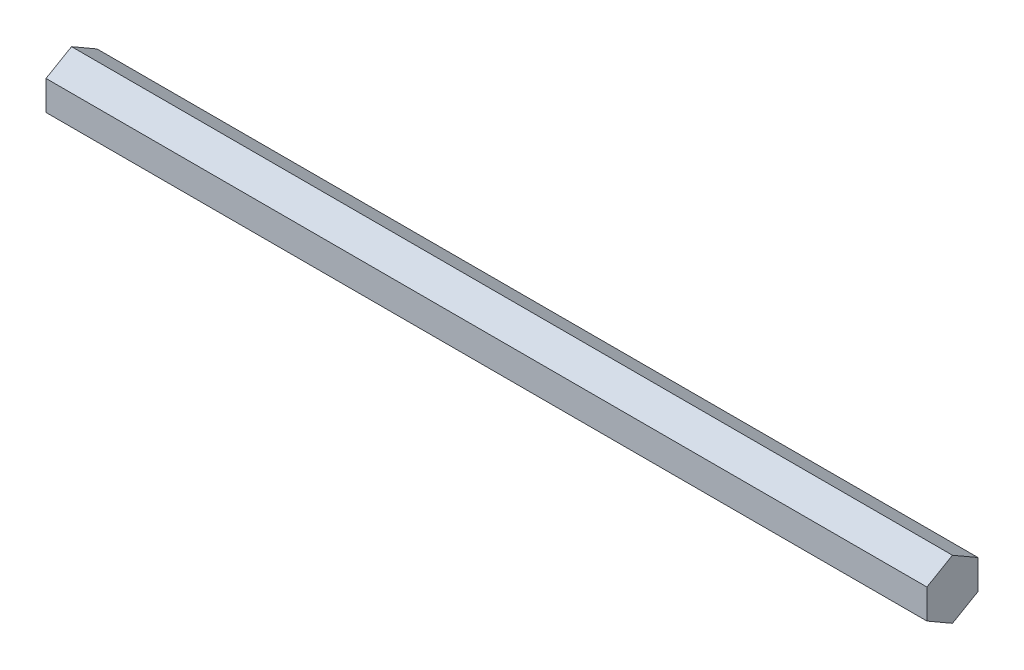
ISO-10303-21;
HEADER;
FILE_DESCRIPTION(('STEP AP214'),'2;1');
FILE_NAME('part.step','',(''),(''),'','','');
FILE_SCHEMA(('AUTOMOTIVE_DESIGN { 1 0 10303 214 1 1 1 1 }'));
ENDSEC;
DATA;
#1=APPLICATION_CONTEXT('core data for automotive mechanical design processes');
#2=APPLICATION_PROTOCOL_DEFINITION('international standard','automotive_design',2000,#1);
#3=PRODUCT_CONTEXT('',#1,'mechanical');
#4=PRODUCT('Part','Part','',(#3));
#5=PRODUCT_RELATED_PRODUCT_CATEGORY('part','',(#4));
#6=PRODUCT_DEFINITION_FORMATION('','',#4);
#7=PRODUCT_DEFINITION_CONTEXT('part definition',#1,'design');
#8=PRODUCT_DEFINITION('design','',#6,#7);
#9=PRODUCT_DEFINITION_SHAPE('','',#8);
#10=(LENGTH_UNIT() NAMED_UNIT(*) SI_UNIT(.MILLI.,.METRE.));
#11=(NAMED_UNIT(*) PLANE_ANGLE_UNIT() SI_UNIT($,.RADIAN.));
#12=(NAMED_UNIT(*) SI_UNIT($,.STERADIAN.) SOLID_ANGLE_UNIT());
#13=UNCERTAINTY_MEASURE_WITH_UNIT(LENGTH_MEASURE(1.E-05),#10,'distance_accuracy_value','');
#14=(GEOMETRIC_REPRESENTATION_CONTEXT(3) GLOBAL_UNCERTAINTY_ASSIGNED_CONTEXT((#13)) GLOBAL_UNIT_ASSIGNED_CONTEXT((#10,
#11,#12)) REPRESENTATION_CONTEXT('',''));
#15=CARTESIAN_POINT('',(0.,0.,0.));
#16=DIRECTION('',(0.,0.,1.));
#17=DIRECTION('',(1.,0.,0.));
#18=AXIS2_PLACEMENT_3D('',#15,#16,#17);
#19=CARTESIAN_POINT('',(142.24,-4.7625,0.));
#20=DIRECTION('',(0.,0.866025403784439,0.5));
#21=DIRECTION('',(0.,-0.5,0.866025403784439));
#22=AXIS2_PLACEMENT_3D('',#19,#20,#21);
#23=PLANE('',#22);
#24=DIRECTION('',(0.,0.499999999999999,-0.866025403784439));
#25=VECTOR('',#24,1.);
#26=CARTESIAN_POINT('',(0.,-4.7625,0.));
#27=LINE('',#26,#25);
#28=CARTESIAN_POINT('',(0.,-4.7625,0.));
#29=VERTEX_POINT('',#28);
#30=CARTESIAN_POINT('',(0.,-2.38125,-4.12444598552339));
#31=VERTEX_POINT('',#30);
#32=EDGE_CURVE('E137',#29,#31,#27,.T.);
#33=ORIENTED_EDGE('',*,*,#32,.T.);
#34=DIRECTION('',(-1.,0.,0.));
#35=VECTOR('',#34,1.);
#36=CARTESIAN_POINT('',(142.24,-2.38125,-4.12444598552339));
#37=LINE('',#36,#35);
#38=CARTESIAN_POINT('',(142.24,-2.38125,-4.12444598552339));
#39=VERTEX_POINT('',#38);
#40=EDGE_CURVE('E11',#39,#31,#37,.T.);
#41=ORIENTED_EDGE('',*,*,#40,.F.);
#42=DIRECTION('',(0.,0.499999999999999,-0.866025403784439));
#43=VECTOR('',#42,1.);
#44=CARTESIAN_POINT('',(142.24,-4.7625,0.));
#45=LINE('',#44,#43);
#46=CARTESIAN_POINT('',(142.24,-4.7625,0.));
#47=VERTEX_POINT('',#46);
#48=EDGE_CURVE('E149',#47,#39,#45,.T.);
#49=ORIENTED_EDGE('',*,*,#48,.F.);
#50=DIRECTION('',(-1.,0.,0.));
#51=VECTOR('',#50,1.);
#52=CARTESIAN_POINT('',(142.24,-4.7625,0.));
#53=LINE('',#52,#51);
#54=EDGE_CURVE('E133',#47,#29,#53,.T.);
#55=ORIENTED_EDGE('',*,*,#54,.T.);
#56=EDGE_LOOP('',(#33,#41,#49,#55));
#57=FACE_BOUND('',#56,.T.);
#58=ADVANCED_FACE('F41',(#57),#23,.F.);
#59=CARTESIAN_POINT('',(142.24,-2.38125,-4.12444598552339));
#60=DIRECTION('',(0.,0.,1.));
#61=DIRECTION('',(1.,0.,0.));
#62=AXIS2_PLACEMENT_3D('',#59,#60,#61);
#63=PLANE('',#62);
#64=DIRECTION('',(0.,1.,0.));
#65=VECTOR('',#64,1.);
#66=CARTESIAN_POINT('',(0.,-2.38125,-4.12444598552339));
#67=LINE('',#66,#65);
#68=CARTESIAN_POINT('',(0.,2.38125,-4.12444598552339));
#69=VERTEX_POINT('',#68);
#70=EDGE_CURVE('E140',#31,#69,#67,.T.);
#71=ORIENTED_EDGE('',*,*,#70,.T.);
#72=DIRECTION('',(-1.,0.,0.));
#73=VECTOR('',#72,1.);
#74=CARTESIAN_POINT('',(142.24,2.38125,-4.12444598552339));
#75=LINE('',#74,#73);
#76=CARTESIAN_POINT('',(142.24,2.38125,-4.12444598552339));
#77=VERTEX_POINT('',#76);
#78=EDGE_CURVE('E48',#77,#69,#75,.T.);
#79=ORIENTED_EDGE('',*,*,#78,.F.);
#80=DIRECTION('',(0.,1.,0.));
#81=VECTOR('',#80,1.);
#82=CARTESIAN_POINT('',(142.24,-2.38125,-4.12444598552339));
#83=LINE('',#82,#81);
#84=EDGE_CURVE('E99',#39,#77,#83,.T.);
#85=ORIENTED_EDGE('',*,*,#84,.F.);
#86=ORIENTED_EDGE('',*,*,#40,.T.);
#87=EDGE_LOOP('',(#71,#79,#85,#86));
#88=FACE_BOUND('',#87,.T.);
#89=ADVANCED_FACE('F200',(#88),#63,.F.);
#90=CARTESIAN_POINT('',(142.24,2.38125,-4.12444598552339));
#91=DIRECTION('',(0.,-0.866025403784439,0.5));
#92=DIRECTION('',(0.,-0.5,-0.866025403784439));
#93=AXIS2_PLACEMENT_3D('',#90,#91,#92);
#94=PLANE('',#93);
#95=DIRECTION('',(0.,0.5,0.866025403784439));
#96=VECTOR('',#95,1.);
#97=CARTESIAN_POINT('',(0.,2.38125,-4.12444598552339));
#98=LINE('',#97,#96);
#99=CARTESIAN_POINT('',(0.,4.7625,0.));
#100=VERTEX_POINT('',#99);
#101=EDGE_CURVE('E143',#69,#100,#98,.T.);
#102=ORIENTED_EDGE('',*,*,#101,.T.);
#103=DIRECTION('',(-1.,0.,0.));
#104=VECTOR('',#103,1.);
#105=CARTESIAN_POINT('',(142.24,4.7625,0.));
#106=LINE('',#105,#104);
#107=CARTESIAN_POINT('',(142.24,4.7625,0.));
#108=VERTEX_POINT('',#107);
#109=EDGE_CURVE('E128',#108,#100,#106,.T.);
#110=ORIENTED_EDGE('',*,*,#109,.F.);
#111=DIRECTION('',(0.,0.5,0.866025403784439));
#112=VECTOR('',#111,1.);
#113=CARTESIAN_POINT('',(142.24,2.38125,-4.12444598552339));
#114=LINE('',#113,#112);
#115=EDGE_CURVE('E116',#77,#108,#114,.T.);
#116=ORIENTED_EDGE('',*,*,#115,.F.);
#117=ORIENTED_EDGE('',*,*,#78,.T.);
#118=EDGE_LOOP('',(#102,#110,#116,#117));
#119=FACE_BOUND('',#118,.T.);
#120=ADVANCED_FACE('F155',(#119),#94,.F.);
#121=CARTESIAN_POINT('',(142.24,4.7625,0.));
#122=DIRECTION('',(0.,-0.866025403784439,-0.5));
#123=DIRECTION('',(0.,0.5,-0.866025403784439));
#124=AXIS2_PLACEMENT_3D('',#121,#122,#123);
#125=PLANE('',#124);
#126=DIRECTION('',(0.,-0.5,0.866025403784439));
#127=VECTOR('',#126,1.);
#128=CARTESIAN_POINT('',(0.,4.7625,0.));
#129=LINE('',#128,#127);
#130=CARTESIAN_POINT('',(0.,2.38125,4.12444598552339));
#131=VERTEX_POINT('',#130);
#132=EDGE_CURVE('E125',#100,#131,#129,.T.);
#133=ORIENTED_EDGE('',*,*,#132,.T.);
#134=DIRECTION('',(-1.,0.,0.));
#135=VECTOR('',#134,1.);
#136=CARTESIAN_POINT('',(142.24,2.38125,4.12444598552339));
#137=LINE('',#136,#135);
#138=CARTESIAN_POINT('',(142.24,2.38125,4.12444598552339));
#139=VERTEX_POINT('',#138);
#140=EDGE_CURVE('E122',#139,#131,#137,.T.);
#141=ORIENTED_EDGE('',*,*,#140,.F.);
#142=DIRECTION('',(0.,-0.5,0.866025403784439));
#143=VECTOR('',#142,1.);
#144=CARTESIAN_POINT('',(142.24,4.7625,0.));
#145=LINE('',#144,#143);
#146=EDGE_CURVE('E109',#108,#139,#145,.T.);
#147=ORIENTED_EDGE('',*,*,#146,.F.);
#148=ORIENTED_EDGE('',*,*,#109,.T.);
#149=EDGE_LOOP('',(#133,#141,#147,#148));
#150=FACE_BOUND('',#149,.T.);
#151=ADVANCED_FACE('F123',(#150),#125,.F.);
#152=CARTESIAN_POINT('',(142.24,2.38125,4.12444598552339));
#153=DIRECTION('',(0.,0.,-1.));
#154=DIRECTION('',(-1.,0.,0.));
#155=AXIS2_PLACEMENT_3D('',#152,#153,#154);
#156=PLANE('',#155);
#157=DIRECTION('',(0.,-1.,0.));
#158=VECTOR('',#157,1.);
#159=CARTESIAN_POINT('',(0.,2.38125,4.12444598552339));
#160=LINE('',#159,#158);
#161=CARTESIAN_POINT('',(0.,-2.38125,4.12444598552339));
#162=VERTEX_POINT('',#161);
#163=EDGE_CURVE('E146',#131,#162,#160,.T.);
#164=ORIENTED_EDGE('',*,*,#163,.T.);
#165=DIRECTION('',(-1.,0.,0.));
#166=VECTOR('',#165,1.);
#167=CARTESIAN_POINT('',(142.24,-2.38125,4.12444598552339));
#168=LINE('',#167,#166);
#169=CARTESIAN_POINT('',(142.24,-2.38125,4.12444598552339));
#170=VERTEX_POINT('',#169);
#171=EDGE_CURVE('E129',#170,#162,#168,.T.);
#172=ORIENTED_EDGE('',*,*,#171,.F.);
#173=DIRECTION('',(0.,-1.,0.));
#174=VECTOR('',#173,1.);
#175=CARTESIAN_POINT('',(142.24,2.38125,4.12444598552339));
#176=LINE('',#175,#174);
#177=EDGE_CURVE('E113',#139,#170,#176,.T.);
#178=ORIENTED_EDGE('',*,*,#177,.F.);
#179=ORIENTED_EDGE('',*,*,#140,.T.);
#180=EDGE_LOOP('',(#164,#172,#178,#179));
#181=FACE_BOUND('',#180,.T.);
#182=ADVANCED_FACE('F131',(#181),#156,.F.);
#183=CARTESIAN_POINT('',(142.24,-2.38125,4.12444598552339));
#184=DIRECTION('',(0.,0.866025403784439,-0.5));
#185=DIRECTION('',(0.,0.5,0.866025403784439));
#186=AXIS2_PLACEMENT_3D('',#183,#184,#185);
#187=PLANE('',#186);
#188=DIRECTION('',(0.,-0.5,-0.866025403784439));
#189=VECTOR('',#188,1.);
#190=CARTESIAN_POINT('',(0.,-2.38125,4.12444598552339));
#191=LINE('',#190,#189);
#192=EDGE_CURVE('E91',#162,#29,#191,.T.);
#193=ORIENTED_EDGE('',*,*,#192,.T.);
#194=ORIENTED_EDGE('',*,*,#54,.F.);
#195=DIRECTION('',(0.,-0.5,-0.866025403784439));
#196=VECTOR('',#195,1.);
#197=CARTESIAN_POINT('',(142.24,-2.38125,4.12444598552339));
#198=LINE('',#197,#196);
#199=EDGE_CURVE('E64',#170,#47,#198,.T.);
#200=ORIENTED_EDGE('',*,*,#199,.F.);
#201=ORIENTED_EDGE('',*,*,#171,.T.);
#202=EDGE_LOOP('',(#193,#194,#200,#201));
#203=FACE_BOUND('',#202,.T.);
#204=ADVANCED_FACE('F159',(#203),#187,.F.);
#205=CARTESIAN_POINT('',(142.24,0.,0.));
#206=DIRECTION('',(1.,0.,0.));
#207=DIRECTION('',(0.,0.,-1.));
#208=AXIS2_PLACEMENT_3D('',#205,#206,#207);
#209=PLANE('',#208);
#210=ORIENTED_EDGE('',*,*,#48,.T.);
#211=ORIENTED_EDGE('',*,*,#84,.T.);
#212=ORIENTED_EDGE('',*,*,#115,.T.);
#213=ORIENTED_EDGE('',*,*,#146,.T.);
#214=ORIENTED_EDGE('',*,*,#177,.T.);
#215=ORIENTED_EDGE('',*,*,#199,.T.);
#216=EDGE_LOOP('',(#210,#211,#212,#213,#214,#215));
#217=FACE_BOUND('',#216,.T.);
#218=ADVANCED_FACE('F111',(#217),#209,.T.);
#219=CARTESIAN_POINT('',(0.,0.,0.));
#220=DIRECTION('',(1.,0.,0.));
#221=DIRECTION('',(0.,0.,-1.));
#222=AXIS2_PLACEMENT_3D('',#219,#220,#221);
#223=PLANE('',#222);
#224=DIRECTION('',(0.,0.,-1.));
#225=VECTOR('',#224,1.);
#226=CARTESIAN_POINT('',(0.,2.4892,-1.66945835527575));
#227=LINE('',#226,#225);
#228=CARTESIAN_POINT('',(0.,2.4892,1.66945835527575));
#229=VERTEX_POINT('',#228);
#230=CARTESIAN_POINT('',(0.,2.4892,-1.66945835527575));
#231=VERTEX_POINT('',#230);
#232=EDGE_CURVE('E170',#229,#231,#227,.T.);
#233=ORIENTED_EDGE('',*,*,#232,.F.);
#234=CARTESIAN_POINT('',(0.,0.,0.));
#235=DIRECTION('',(-1.,0.,0.));
#236=DIRECTION('',(0.,0.,1.));
#237=AXIS2_PLACEMENT_3D('',#234,#235,#236);
#238=CIRCLE('',#237,2.9972);
#239=EDGE_CURVE('E55',#231,#229,#238,.T.);
#240=ORIENTED_EDGE('',*,*,#239,.F.);
#241=EDGE_LOOP('',(#233,#240));
#242=FACE_BOUND('',#241,.T.);
#243=ORIENTED_EDGE('',*,*,#32,.F.);
#244=ORIENTED_EDGE('',*,*,#192,.F.);
#245=ORIENTED_EDGE('',*,*,#163,.F.);
#246=ORIENTED_EDGE('',*,*,#132,.F.);
#247=ORIENTED_EDGE('',*,*,#101,.F.);
#248=ORIENTED_EDGE('',*,*,#70,.F.);
#249=EDGE_LOOP('',(#243,#244,#245,#246,#247,#248));
#250=FACE_BOUND('',#249,.T.);
#251=ADVANCED_FACE('F158',(#242,#250),#223,.F.);
#252=CARTESIAN_POINT('',(13.97,0.,0.));
#253=DIRECTION('',(-1.,0.,0.));
#254=DIRECTION('',(0.,0.,1.));
#255=AXIS2_PLACEMENT_3D('',#252,#253,#254);
#256=CYLINDRICAL_SURFACE('',#255,2.9972);
#257=ORIENTED_EDGE('',*,*,#239,.T.);
#258=DIRECTION('',(-1.,0.,0.));
#259=VECTOR('',#258,1.);
#260=CARTESIAN_POINT('',(13.97,2.4892,1.66945835527575));
#261=LINE('',#260,#259);
#262=CARTESIAN_POINT('',(13.97,2.4892,1.66945835527575));
#263=VERTEX_POINT('',#262);
#264=EDGE_CURVE('E166',#263,#229,#261,.T.);
#265=ORIENTED_EDGE('',*,*,#264,.F.);
#266=CARTESIAN_POINT('',(13.97,0.,0.));
#267=DIRECTION('',(-1.,0.,0.));
#268=DIRECTION('',(0.,0.,1.));
#269=AXIS2_PLACEMENT_3D('',#266,#267,#268);
#270=CIRCLE('',#269,2.9972);
#271=CARTESIAN_POINT('',(13.97,2.4892,-1.66945835527575));
#272=VERTEX_POINT('',#271);
#273=EDGE_CURVE('E173',#272,#263,#270,.T.);
#274=ORIENTED_EDGE('',*,*,#273,.F.);
#275=DIRECTION('',(-1.,0.,0.));
#276=VECTOR('',#275,1.);
#277=CARTESIAN_POINT('',(13.97,2.4892,-1.66945835527575));
#278=LINE('',#277,#276);
#279=EDGE_CURVE('E141',#272,#231,#278,.T.);
#280=ORIENTED_EDGE('',*,*,#279,.T.);
#281=EDGE_LOOP('',(#257,#265,#274,#280));
#282=FACE_BOUND('',#281,.T.);
#283=ADVANCED_FACE('F188',(#282),#256,.F.);
#284=CARTESIAN_POINT('',(13.97,2.4892,-1.66945835527575));
#285=DIRECTION('',(0.,1.,0.));
#286=DIRECTION('',(0.,0.,1.));
#287=AXIS2_PLACEMENT_3D('',#284,#285,#286);
#288=PLANE('',#287);
#289=ORIENTED_EDGE('',*,*,#232,.T.);
#290=ORIENTED_EDGE('',*,*,#279,.F.);
#291=DIRECTION('',(0.,0.,-1.));
#292=VECTOR('',#291,1.);
#293=CARTESIAN_POINT('',(13.97,2.4892,-1.66945835527575));
#294=LINE('',#293,#292);
#295=EDGE_CURVE('E168',#263,#272,#294,.T.);
#296=ORIENTED_EDGE('',*,*,#295,.F.);
#297=ORIENTED_EDGE('',*,*,#264,.T.);
#298=EDGE_LOOP('',(#289,#290,#296,#297));
#299=FACE_BOUND('',#298,.T.);
#300=ADVANCED_FACE('F186',(#299),#288,.F.);
#301=CARTESIAN_POINT('',(13.97,0.,0.));
#302=DIRECTION('',(-1.,0.,0.));
#303=DIRECTION('',(0.,0.,1.));
#304=AXIS2_PLACEMENT_3D('',#301,#302,#303);
#305=PLANE('',#304);
#306=ORIENTED_EDGE('',*,*,#273,.T.);
#307=ORIENTED_EDGE('',*,*,#295,.T.);
#308=EDGE_LOOP('',(#306,#307));
#309=FACE_BOUND('',#308,.T.);
#310=ADVANCED_FACE('F182',(#309),#305,.T.);
#311=CLOSED_SHELL('',(#58,#89,#120,#151,#182,#204,#218,#251,#283,#300,#310));
#312=MANIFOLD_SOLID_BREP('B2',#311);
#313=ADVANCED_BREP_SHAPE_REPRESENTATION('',(#18,#312),#14);
#314=SHAPE_DEFINITION_REPRESENTATION(#9,#313);
ENDSEC;
END-ISO-10303-21;
